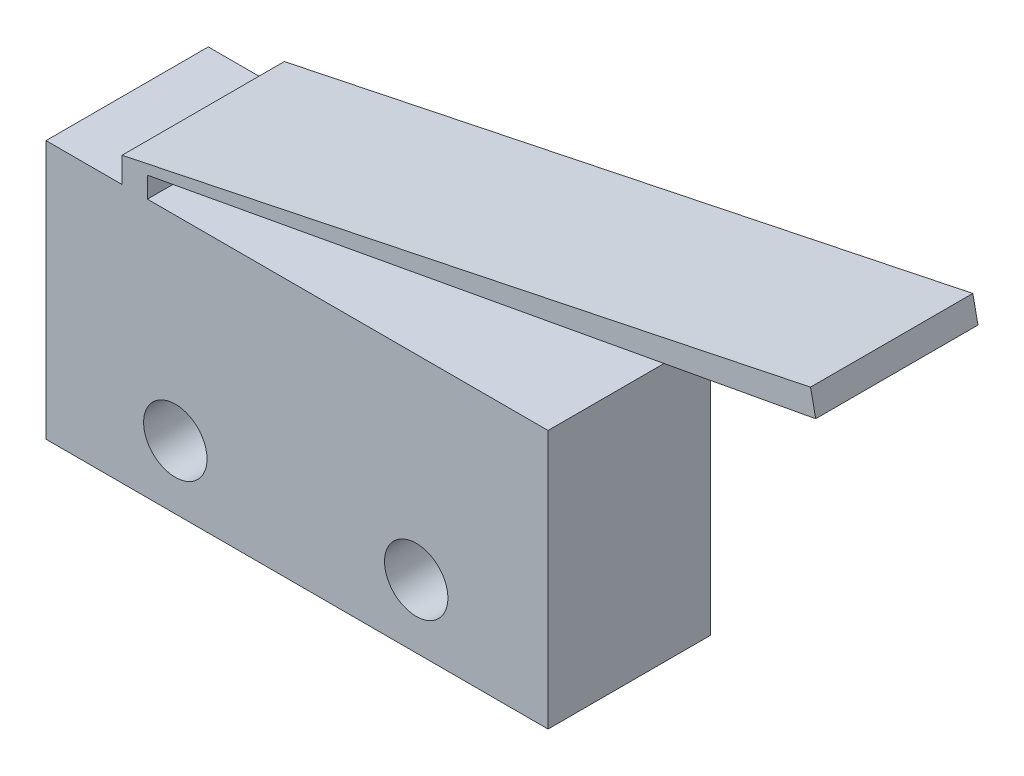
ISO-10303-21;
HEADER;
FILE_DESCRIPTION(('STEP AP214'),'2;1');
FILE_NAME('part.step','',(''),(''),'','','');
FILE_SCHEMA(('AUTOMOTIVE_DESIGN { 1 0 10303 214 1 1 1 1 }'));
ENDSEC;
DATA;
#1=APPLICATION_CONTEXT('core data for automotive mechanical design processes');
#2=APPLICATION_PROTOCOL_DEFINITION('international standard','automotive_design',2000,#1);
#3=PRODUCT_CONTEXT('',#1,'mechanical');
#4=PRODUCT('Part','Part','',(#3));
#5=PRODUCT_RELATED_PRODUCT_CATEGORY('part','',(#4));
#6=PRODUCT_DEFINITION_FORMATION('','',#4);
#7=PRODUCT_DEFINITION_CONTEXT('part definition',#1,'design');
#8=PRODUCT_DEFINITION('design','',#6,#7);
#9=PRODUCT_DEFINITION_SHAPE('','',#8);
#10=(LENGTH_UNIT() NAMED_UNIT(*) SI_UNIT(.MILLI.,.METRE.));
#11=(NAMED_UNIT(*) PLANE_ANGLE_UNIT() SI_UNIT($,.RADIAN.));
#12=(NAMED_UNIT(*) SI_UNIT($,.STERADIAN.) SOLID_ANGLE_UNIT());
#13=UNCERTAINTY_MEASURE_WITH_UNIT(LENGTH_MEASURE(1.E-05),#10,'distance_accuracy_value','');
#14=(GEOMETRIC_REPRESENTATION_CONTEXT(3) GLOBAL_UNCERTAINTY_ASSIGNED_CONTEXT((#13)) GLOBAL_UNIT_ASSIGNED_CONTEXT((#10,
#11,#12)) REPRESENTATION_CONTEXT('',''));
#15=CARTESIAN_POINT('',(0.,0.,0.));
#16=DIRECTION('',(0.,0.,1.));
#17=DIRECTION('',(1.,0.,0.));
#18=AXIS2_PLACEMENT_3D('',#15,#16,#17);
#19=CARTESIAN_POINT('',(14.7,0.,6.4));
#20=DIRECTION('',(1.,0.,0.));
#21=DIRECTION('',(0.,1.,0.));
#22=AXIS2_PLACEMENT_3D('',#19,#20,#21);
#23=PLANE('',#22);
#24=DIRECTION('',(0.,-1.,0.));
#25=VECTOR('',#24,1.);
#26=CARTESIAN_POINT('',(14.7,0.,0.));
#27=LINE('',#26,#25);
#28=CARTESIAN_POINT('',(14.7,7.7,0.));
#29=VERTEX_POINT('',#28);
#30=CARTESIAN_POINT('',(14.7,-2.5,0.));
#31=VERTEX_POINT('',#30);
#32=EDGE_CURVE('E218',#29,#31,#27,.T.);
#33=ORIENTED_EDGE('',*,*,#32,.F.);
#34=DIRECTION('',(0.,0.,-1.));
#35=VECTOR('',#34,1.);
#36=CARTESIAN_POINT('',(14.7,7.7,6.4));
#37=LINE('',#36,#35);
#38=CARTESIAN_POINT('',(14.7,7.7,6.4));
#39=VERTEX_POINT('',#38);
#40=EDGE_CURVE('E11',#39,#29,#37,.T.);
#41=ORIENTED_EDGE('',*,*,#40,.F.);
#42=DIRECTION('',(0.,-1.,0.));
#43=VECTOR('',#42,1.);
#44=CARTESIAN_POINT('',(14.7,0.,6.4));
#45=LINE('',#44,#43);
#46=CARTESIAN_POINT('',(14.7,-2.5,6.4));
#47=VERTEX_POINT('',#46);
#48=EDGE_CURVE('E163',#39,#47,#45,.T.);
#49=ORIENTED_EDGE('',*,*,#48,.T.);
#50=DIRECTION('',(0.,0.,-1.));
#51=VECTOR('',#50,1.);
#52=CARTESIAN_POINT('',(14.7,-2.5,6.4));
#53=LINE('',#52,#51);
#54=EDGE_CURVE('E104',#47,#31,#53,.T.);
#55=ORIENTED_EDGE('',*,*,#54,.T.);
#56=EDGE_LOOP('',(#33,#41,#49,#55));
#57=FACE_BOUND('',#56,.T.);
#58=ADVANCED_FACE('F45',(#57),#23,.T.);
#59=CARTESIAN_POINT('',(0.,7.7,6.4));
#60=DIRECTION('',(0.,1.,0.));
#61=DIRECTION('',(0.,0.,1.));
#62=AXIS2_PLACEMENT_3D('',#59,#60,#61);
#63=PLANE('',#62);
#64=DIRECTION('',(1.,0.,0.));
#65=VECTOR('',#64,1.);
#66=CARTESIAN_POINT('',(0.,7.7,0.));
#67=LINE('',#66,#65);
#68=CARTESIAN_POINT('',(-1.1,7.7,0.));
#69=VERTEX_POINT('',#68);
#70=EDGE_CURVE('E215',#69,#29,#67,.T.);
#71=ORIENTED_EDGE('',*,*,#70,.F.);
#72=DIRECTION('',(0.,0.,-1.));
#73=VECTOR('',#72,1.);
#74=CARTESIAN_POINT('',(-1.1,7.7,6.4));
#75=LINE('',#74,#73);
#76=CARTESIAN_POINT('',(-1.1,7.7,6.4));
#77=VERTEX_POINT('',#76);
#78=EDGE_CURVE('E55',#77,#69,#75,.T.);
#79=ORIENTED_EDGE('',*,*,#78,.F.);
#80=DIRECTION('',(1.,0.,0.));
#81=VECTOR('',#80,1.);
#82=CARTESIAN_POINT('',(0.,7.7,6.4));
#83=LINE('',#82,#81);
#84=EDGE_CURVE('E154',#77,#39,#83,.T.);
#85=ORIENTED_EDGE('',*,*,#84,.T.);
#86=ORIENTED_EDGE('',*,*,#40,.T.);
#87=EDGE_LOOP('',(#71,#79,#85,#86));
#88=FACE_BOUND('',#87,.T.);
#89=ADVANCED_FACE('F216',(#88),#63,.T.);
#90=CARTESIAN_POINT('',(-1.1,0.,6.4));
#91=DIRECTION('',(1.,0.,0.));
#92=DIRECTION('',(0.,1.,0.));
#93=AXIS2_PLACEMENT_3D('',#90,#91,#92);
#94=PLANE('',#93);
#95=DIRECTION('',(0.,-1.,0.));
#96=VECTOR('',#95,1.);
#97=CARTESIAN_POINT('',(-1.1,0.,0.));
#98=LINE('',#97,#96);
#99=CARTESIAN_POINT('',(-1.1,8.52000906146548,0.));
#100=VERTEX_POINT('',#99);
#101=EDGE_CURVE('E211',#100,#69,#98,.T.);
#102=ORIENTED_EDGE('',*,*,#101,.F.);
#103=DIRECTION('',(0.,0.,-1.));
#104=VECTOR('',#103,1.);
#105=CARTESIAN_POINT('',(-1.1,8.52000906146548,6.4));
#106=LINE('',#105,#104);
#107=CARTESIAN_POINT('',(-1.1,8.52000906146548,6.4));
#108=VERTEX_POINT('',#107);
#109=EDGE_CURVE('E203',#108,#100,#106,.T.);
#110=ORIENTED_EDGE('',*,*,#109,.F.);
#111=DIRECTION('',(0.,-1.,0.));
#112=VECTOR('',#111,1.);
#113=CARTESIAN_POINT('',(-1.1,0.,6.4));
#114=LINE('',#113,#112);
#115=EDGE_CURVE('E162',#108,#77,#114,.T.);
#116=ORIENTED_EDGE('',*,*,#115,.T.);
#117=ORIENTED_EDGE('',*,*,#78,.T.);
#118=EDGE_LOOP('',(#102,#110,#116,#117));
#119=FACE_BOUND('',#118,.T.);
#120=ADVANCED_FACE('F209',(#119),#94,.T.);
#121=CARTESIAN_POINT('',(-1.55487517236852,8.43617077381033,6.4));
#122=DIRECTION('',(0.181257555508548,-0.983435660615917,0.));
#123=DIRECTION('',(0.983435660615917,0.181257555508548,0.));
#124=AXIS2_PLACEMENT_3D('',#121,#122,#123);
#125=PLANE('',#124);
#126=DIRECTION('',(-0.983435660615917,-0.181257555508548,0.));
#127=VECTOR('',#126,1.);
#128=CARTESIAN_POINT('',(-1.55487517236852,8.43617077381033,0.));
#129=LINE('',#128,#127);
#130=CARTESIAN_POINT('',(25.2560757045066,13.3777115490946,0.));
#131=VERTEX_POINT('',#130);
#132=EDGE_CURVE('E223',#131,#100,#129,.T.);
#133=ORIENTED_EDGE('',*,*,#132,.F.);
#134=DIRECTION('',(0.,0.,-1.));
#135=VECTOR('',#134,1.);
#136=CARTESIAN_POINT('',(25.2560757045066,13.3777115490946,6.4));
#137=LINE('',#136,#135);
#138=CARTESIAN_POINT('',(25.2560757045066,13.3777115490946,6.4));
#139=VERTEX_POINT('',#138);
#140=EDGE_CURVE('E200',#139,#131,#137,.T.);
#141=ORIENTED_EDGE('',*,*,#140,.F.);
#142=DIRECTION('',(-0.983435660615917,-0.181257555508548,0.));
#143=VECTOR('',#142,1.);
#144=CARTESIAN_POINT('',(-1.55487517236852,8.43617077381033,6.4));
#145=LINE('',#144,#143);
#146=EDGE_CURVE('E169',#139,#108,#145,.T.);
#147=ORIENTED_EDGE('',*,*,#146,.T.);
#148=ORIENTED_EDGE('',*,*,#109,.T.);
#149=EDGE_LOOP('',(#133,#141,#147,#148));
#150=FACE_BOUND('',#149,.T.);
#151=ADVANCED_FACE('F256',(#150),#125,.T.);
#152=CARTESIAN_POINT('',(26.8765806850036,5.59928764270899,6.4));
#153=DIRECTION('',(0.978980419737606,0.203954254111998,0.));
#154=DIRECTION('',(-0.203954254111998,0.978980419737606,0.));
#155=AXIS2_PLACEMENT_3D('',#152,#153,#154);
#156=PLANE('',#155);
#157=DIRECTION('',(0.203954254111998,-0.978980419737606,0.));
#158=VECTOR('',#157,1.);
#159=CARTESIAN_POINT('',(26.8765806850036,5.59928764270899,0.));
#160=LINE('',#159,#158);
#161=CARTESIAN_POINT('',(25.0521214503946,14.3566919688322,0.));
#162=VERTEX_POINT('',#161);
#163=EDGE_CURVE('E227',#162,#131,#160,.T.);
#164=ORIENTED_EDGE('',*,*,#163,.F.);
#165=DIRECTION('',(0.,0.,-1.));
#166=VECTOR('',#165,1.);
#167=CARTESIAN_POINT('',(25.0521214503946,14.3566919688322,6.4));
#168=LINE('',#167,#166);
#169=CARTESIAN_POINT('',(25.0521214503946,14.3566919688322,6.4));
#170=VERTEX_POINT('',#169);
#171=EDGE_CURVE('E197',#170,#162,#168,.T.);
#172=ORIENTED_EDGE('',*,*,#171,.F.);
#173=DIRECTION('',(0.203954254111998,-0.978980419737606,0.));
#174=VECTOR('',#173,1.);
#175=CARTESIAN_POINT('',(26.8765806850036,5.59928764270899,6.4));
#176=LINE('',#175,#174);
#177=EDGE_CURVE('E252',#170,#139,#176,.T.);
#178=ORIENTED_EDGE('',*,*,#177,.T.);
#179=ORIENTED_EDGE('',*,*,#140,.T.);
#180=EDGE_LOOP('',(#164,#172,#178,#179));
#181=FACE_BOUND('',#180,.T.);
#182=ADVANCED_FACE('F251',(#181),#156,.T.);
#183=CARTESIAN_POINT('',(-1.82445923460898,8.75740432612313,6.4));
#184=DIRECTION('',(-0.203954254112,0.978980419737605,0.));
#185=DIRECTION('',(-0.978980419737605,-0.203954254112,0.));
#186=AXIS2_PLACEMENT_3D('',#183,#184,#185);
#187=PLANE('',#186);
#188=DIRECTION('',(0.978980419737605,0.203954254112,0.));
#189=VECTOR('',#188,1.);
#190=CARTESIAN_POINT('',(-1.82445923460898,8.75740432612313,0.));
#191=LINE('',#190,#189);
#192=CARTESIAN_POINT('',(-2.1,8.7,0.));
#193=VERTEX_POINT('',#192);
#194=EDGE_CURVE('E233',#193,#162,#191,.T.);
#195=ORIENTED_EDGE('',*,*,#194,.F.);
#196=DIRECTION('',(0.,0.,-1.));
#197=VECTOR('',#196,1.);
#198=CARTESIAN_POINT('',(-2.1,8.7,6.4));
#199=LINE('',#198,#197);
#200=CARTESIAN_POINT('',(-2.1,8.7,6.4));
#201=VERTEX_POINT('',#200);
#202=EDGE_CURVE('E194',#201,#193,#199,.T.);
#203=ORIENTED_EDGE('',*,*,#202,.F.);
#204=DIRECTION('',(0.978980419737605,0.203954254112,0.));
#205=VECTOR('',#204,1.);
#206=CARTESIAN_POINT('',(-1.82445923460898,8.75740432612313,6.4));
#207=LINE('',#206,#205);
#208=EDGE_CURVE('E156',#201,#170,#207,.T.);
#209=ORIENTED_EDGE('',*,*,#208,.T.);
#210=ORIENTED_EDGE('',*,*,#171,.T.);
#211=EDGE_LOOP('',(#195,#203,#209,#210));
#212=FACE_BOUND('',#211,.T.);
#213=ADVANCED_FACE('F246',(#212),#187,.T.);
#214=CARTESIAN_POINT('',(-2.1,0.,6.4));
#215=DIRECTION('',(-1.,0.,0.));
#216=DIRECTION('',(0.,0.,1.));
#217=AXIS2_PLACEMENT_3D('',#214,#215,#216);
#218=PLANE('',#217);
#219=DIRECTION('',(0.,1.,0.));
#220=VECTOR('',#219,1.);
#221=CARTESIAN_POINT('',(-2.1,0.,0.));
#222=LINE('',#221,#220);
#223=CARTESIAN_POINT('',(-2.1,7.7,0.));
#224=VERTEX_POINT('',#223);
#225=EDGE_CURVE('E236',#224,#193,#222,.T.);
#226=ORIENTED_EDGE('',*,*,#225,.F.);
#227=DIRECTION('',(0.,0.,-1.));
#228=VECTOR('',#227,1.);
#229=CARTESIAN_POINT('',(-2.1,7.7,6.4));
#230=LINE('',#229,#228);
#231=CARTESIAN_POINT('',(-2.1,7.7,6.4));
#232=VERTEX_POINT('',#231);
#233=EDGE_CURVE('E139',#232,#224,#230,.T.);
#234=ORIENTED_EDGE('',*,*,#233,.F.);
#235=DIRECTION('',(0.,1.,0.));
#236=VECTOR('',#235,1.);
#237=CARTESIAN_POINT('',(-2.1,0.,6.4));
#238=LINE('',#237,#236);
#239=EDGE_CURVE('E151',#232,#201,#238,.T.);
#240=ORIENTED_EDGE('',*,*,#239,.T.);
#241=ORIENTED_EDGE('',*,*,#202,.T.);
#242=EDGE_LOOP('',(#226,#234,#240,#241));
#243=FACE_BOUND('',#242,.T.);
#244=ADVANCED_FACE('F243',(#243),#218,.T.);
#245=CARTESIAN_POINT('',(-5.1,7.7,0.));
#246=VERTEX_POINT('',#245);
#247=EDGE_CURVE('E135',#246,#224,#67,.T.);
#248=ORIENTED_EDGE('',*,*,#247,.F.);
#249=DIRECTION('',(0.,0.,-1.));
#250=VECTOR('',#249,1.);
#251=CARTESIAN_POINT('',(-5.1,7.7,6.4));
#252=LINE('',#251,#250);
#253=CARTESIAN_POINT('',(-5.1,7.7,6.4));
#254=VERTEX_POINT('',#253);
#255=EDGE_CURVE('E129',#254,#246,#252,.T.);
#256=ORIENTED_EDGE('',*,*,#255,.F.);
#257=EDGE_CURVE('E133',#254,#232,#83,.T.);
#258=ORIENTED_EDGE('',*,*,#257,.T.);
#259=ORIENTED_EDGE('',*,*,#233,.T.);
#260=EDGE_LOOP('',(#248,#256,#258,#259));
#261=FACE_BOUND('',#260,.T.);
#262=ADVANCED_FACE('F131',(#261),#63,.T.);
#263=CARTESIAN_POINT('',(-5.1,0.,6.4));
#264=DIRECTION('',(1.,0.,0.));
#265=DIRECTION('',(0.,1.,0.));
#266=AXIS2_PLACEMENT_3D('',#263,#264,#265);
#267=PLANE('',#266);
#268=DIRECTION('',(0.,-1.,0.));
#269=VECTOR('',#268,1.);
#270=CARTESIAN_POINT('',(-5.1,0.,0.));
#271=LINE('',#270,#269);
#272=CARTESIAN_POINT('',(-5.1,-2.5,0.));
#273=VERTEX_POINT('',#272);
#274=EDGE_CURVE('E181',#246,#273,#271,.T.);
#275=ORIENTED_EDGE('',*,*,#274,.T.);
#276=DIRECTION('',(0.,0.,-1.));
#277=VECTOR('',#276,1.);
#278=CARTESIAN_POINT('',(-5.1,-2.5,6.4));
#279=LINE('',#278,#277);
#280=CARTESIAN_POINT('',(-5.1,-2.5,6.4));
#281=VERTEX_POINT('',#280);
#282=EDGE_CURVE('E140',#281,#273,#279,.T.);
#283=ORIENTED_EDGE('',*,*,#282,.F.);
#284=DIRECTION('',(0.,-1.,0.));
#285=VECTOR('',#284,1.);
#286=CARTESIAN_POINT('',(-5.1,0.,6.4));
#287=LINE('',#286,#285);
#288=EDGE_CURVE('E143',#254,#281,#287,.T.);
#289=ORIENTED_EDGE('',*,*,#288,.F.);
#290=ORIENTED_EDGE('',*,*,#255,.T.);
#291=EDGE_LOOP('',(#275,#283,#289,#290));
#292=FACE_BOUND('',#291,.T.);
#293=ADVANCED_FACE('F144',(#292),#267,.F.);
#294=CARTESIAN_POINT('',(0.,0.,6.4));
#295=DIRECTION('',(0.,0.,-1.));
#296=DIRECTION('',(-1.,0.,0.));
#297=AXIS2_PLACEMENT_3D('',#294,#295,#296);
#298=CYLINDRICAL_SURFACE('',#297,1.25);
#299=CARTESIAN_POINT('',(0.,0.,6.4));
#300=DIRECTION('',(0.,0.,1.));
#301=DIRECTION('',(1.,0.,0.));
#302=AXIS2_PLACEMENT_3D('',#299,#300,#301);
#303=CIRCLE('',#302,1.25);
#304=CARTESIAN_POINT('',(1.25,0.,6.4));
#305=VERTEX_POINT('',#304);
#306=EDGE_CURVE('E170',#305,#305,#303,.T.);
#307=ORIENTED_EDGE('',*,*,#306,.T.);
#308=EDGE_LOOP('',(#307));
#309=FACE_BOUND('',#308,.T.);
#310=CARTESIAN_POINT('',(0.,0.,0.));
#311=DIRECTION('',(0.,0.,1.));
#312=DIRECTION('',(1.,0.,0.));
#313=AXIS2_PLACEMENT_3D('',#310,#311,#312);
#314=CIRCLE('',#313,1.25);
#315=CARTESIAN_POINT('',(1.25,0.,0.));
#316=VERTEX_POINT('',#315);
#317=EDGE_CURVE('E270',#316,#316,#314,.T.);
#318=ORIENTED_EDGE('',*,*,#317,.F.);
#319=EDGE_LOOP('',(#318));
#320=FACE_BOUND('',#319,.T.);
#321=ADVANCED_FACE('F282',(#309,#320),#298,.F.);
#322=CARTESIAN_POINT('',(9.5,0.,6.4));
#323=DIRECTION('',(0.,0.,-1.));
#324=DIRECTION('',(-1.,0.,0.));
#325=AXIS2_PLACEMENT_3D('',#322,#323,#324);
#326=CYLINDRICAL_SURFACE('',#325,1.25);
#327=CARTESIAN_POINT('',(9.5,0.,6.4));
#328=DIRECTION('',(0.,0.,1.));
#329=DIRECTION('',(1.,0.,0.));
#330=AXIS2_PLACEMENT_3D('',#327,#328,#329);
#331=CIRCLE('',#330,1.25);
#332=CARTESIAN_POINT('',(10.75,0.,6.4));
#333=VERTEX_POINT('',#332);
#334=EDGE_CURVE('E173',#333,#333,#331,.T.);
#335=ORIENTED_EDGE('',*,*,#334,.T.);
#336=EDGE_LOOP('',(#335));
#337=FACE_BOUND('',#336,.T.);
#338=CARTESIAN_POINT('',(9.5,0.,0.));
#339=DIRECTION('',(0.,0.,1.));
#340=DIRECTION('',(1.,0.,0.));
#341=AXIS2_PLACEMENT_3D('',#338,#339,#340);
#342=CIRCLE('',#341,1.25);
#343=CARTESIAN_POINT('',(10.75,0.,0.));
#344=VERTEX_POINT('',#343);
#345=EDGE_CURVE('E266',#344,#344,#342,.T.);
#346=ORIENTED_EDGE('',*,*,#345,.F.);
#347=EDGE_LOOP('',(#346));
#348=FACE_BOUND('',#347,.T.);
#349=ADVANCED_FACE('F47',(#337,#348),#326,.F.);
#350=CARTESIAN_POINT('',(0.,-2.5,6.4));
#351=DIRECTION('',(0.,1.,0.));
#352=DIRECTION('',(0.,0.,1.));
#353=AXIS2_PLACEMENT_3D('',#350,#351,#352);
#354=PLANE('',#353);
#355=DIRECTION('',(1.,0.,0.));
#356=VECTOR('',#355,1.);
#357=CARTESIAN_POINT('',(0.,-2.5,0.));
#358=LINE('',#357,#356);
#359=EDGE_CURVE('E97',#273,#31,#358,.T.);
#360=ORIENTED_EDGE('',*,*,#359,.T.);
#361=ORIENTED_EDGE('',*,*,#54,.F.);
#362=DIRECTION('',(1.,0.,0.));
#363=VECTOR('',#362,1.);
#364=CARTESIAN_POINT('',(0.,-2.5,6.4));
#365=LINE('',#364,#363);
#366=EDGE_CURVE('E63',#281,#47,#365,.T.);
#367=ORIENTED_EDGE('',*,*,#366,.F.);
#368=ORIENTED_EDGE('',*,*,#282,.T.);
#369=EDGE_LOOP('',(#360,#361,#367,#368));
#370=FACE_BOUND('',#369,.T.);
#371=ADVANCED_FACE('F289',(#370),#354,.F.);
#372=CARTESIAN_POINT('',(0.,0.,6.4));
#373=DIRECTION('',(0.,0.,1.));
#374=DIRECTION('',(1.,0.,0.));
#375=AXIS2_PLACEMENT_3D('',#372,#373,#374);
#376=PLANE('',#375);
#377=ORIENTED_EDGE('',*,*,#334,.F.);
#378=EDGE_LOOP('',(#377));
#379=FACE_BOUND('',#378,.T.);
#380=ORIENTED_EDGE('',*,*,#306,.F.);
#381=EDGE_LOOP('',(#380));
#382=FACE_BOUND('',#381,.T.);
#383=ORIENTED_EDGE('',*,*,#48,.F.);
#384=ORIENTED_EDGE('',*,*,#84,.F.);
#385=ORIENTED_EDGE('',*,*,#115,.F.);
#386=ORIENTED_EDGE('',*,*,#146,.F.);
#387=ORIENTED_EDGE('',*,*,#177,.F.);
#388=ORIENTED_EDGE('',*,*,#208,.F.);
#389=ORIENTED_EDGE('',*,*,#239,.F.);
#390=ORIENTED_EDGE('',*,*,#257,.F.);
#391=ORIENTED_EDGE('',*,*,#288,.T.);
#392=ORIENTED_EDGE('',*,*,#366,.T.);
#393=EDGE_LOOP('',(#383,#384,#385,#386,#387,#388,#389,#390,#391,#392));
#394=FACE_BOUND('',#393,.T.);
#395=ADVANCED_FACE('F148',(#379,#382,#394),#376,.T.);
#396=CARTESIAN_POINT('',(0.,0.,0.));
#397=DIRECTION('',(0.,0.,1.));
#398=DIRECTION('',(1.,0.,0.));
#399=AXIS2_PLACEMENT_3D('',#396,#397,#398);
#400=PLANE('',#399);
#401=ORIENTED_EDGE('',*,*,#345,.T.);
#402=EDGE_LOOP('',(#401));
#403=FACE_BOUND('',#402,.T.);
#404=ORIENTED_EDGE('',*,*,#317,.T.);
#405=EDGE_LOOP('',(#404));
#406=FACE_BOUND('',#405,.T.);
#407=ORIENTED_EDGE('',*,*,#32,.T.);
#408=ORIENTED_EDGE('',*,*,#359,.F.);
#409=ORIENTED_EDGE('',*,*,#274,.F.);
#410=ORIENTED_EDGE('',*,*,#247,.T.);
#411=ORIENTED_EDGE('',*,*,#225,.T.);
#412=ORIENTED_EDGE('',*,*,#194,.T.);
#413=ORIENTED_EDGE('',*,*,#163,.T.);
#414=ORIENTED_EDGE('',*,*,#132,.T.);
#415=ORIENTED_EDGE('',*,*,#101,.T.);
#416=ORIENTED_EDGE('',*,*,#70,.T.);
#417=EDGE_LOOP('',(#407,#408,#409,#410,#411,#412,#413,#414,#415,#416));
#418=FACE_BOUND('',#417,.T.);
#419=ADVANCED_FACE('F220',(#403,#406,#418),#400,.F.);
#420=CLOSED_SHELL('',(#58,#89,#120,#151,#182,#213,#244,#262,#293,#321,#349,#371,#395,#419));
#421=MANIFOLD_SOLID_BREP('B2',#420);
#422=ADVANCED_BREP_SHAPE_REPRESENTATION('',(#18,#421),#14);
#423=SHAPE_DEFINITION_REPRESENTATION(#9,#422);
ENDSEC;
END-ISO-10303-21;
